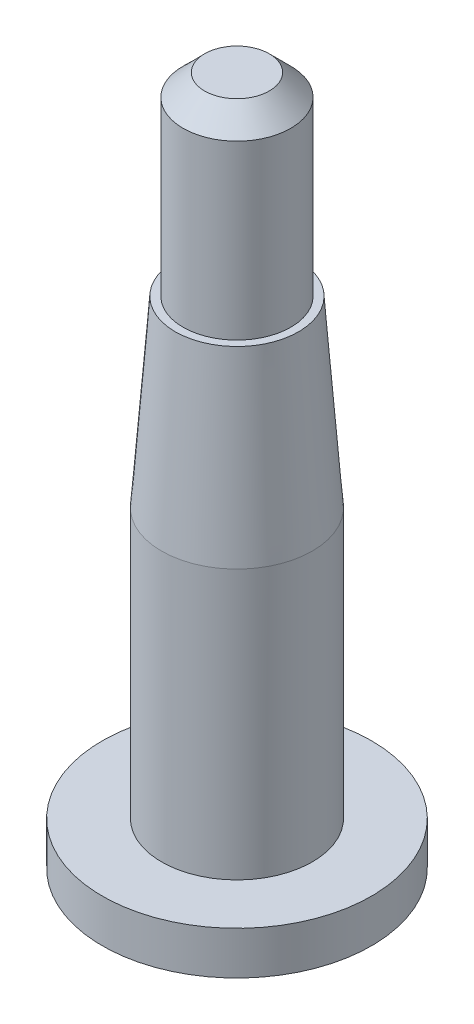
ISO-10303-21;
HEADER;
FILE_DESCRIPTION(('STEP AP214'),'2;1');
FILE_NAME('part.step','',(''),(''),'','','');
FILE_SCHEMA(('AUTOMOTIVE_DESIGN { 1 0 10303 214 1 1 1 1 }'));
ENDSEC;
DATA;
#1=APPLICATION_CONTEXT('core data for automotive mechanical design processes');
#2=APPLICATION_PROTOCOL_DEFINITION('international standard','automotive_design',2000,#1);
#3=PRODUCT_CONTEXT('',#1,'mechanical');
#4=PRODUCT('Part','Part','',(#3));
#5=PRODUCT_RELATED_PRODUCT_CATEGORY('part','',(#4));
#6=PRODUCT_DEFINITION_FORMATION('','',#4);
#7=PRODUCT_DEFINITION_CONTEXT('part definition',#1,'design');
#8=PRODUCT_DEFINITION('design','',#6,#7);
#9=PRODUCT_DEFINITION_SHAPE('','',#8);
#10=(LENGTH_UNIT() NAMED_UNIT(*) SI_UNIT(.MILLI.,.METRE.));
#11=(NAMED_UNIT(*) PLANE_ANGLE_UNIT() SI_UNIT($,.RADIAN.));
#12=(NAMED_UNIT(*) SI_UNIT($,.STERADIAN.) SOLID_ANGLE_UNIT());
#13=UNCERTAINTY_MEASURE_WITH_UNIT(LENGTH_MEASURE(1.E-05),#10,'distance_accuracy_value','');
#14=(GEOMETRIC_REPRESENTATION_CONTEXT(3) GLOBAL_UNCERTAINTY_ASSIGNED_CONTEXT((#13)) GLOBAL_UNIT_ASSIGNED_CONTEXT((#10,
#11,#12)) REPRESENTATION_CONTEXT('',''));
#15=CARTESIAN_POINT('',(0.,0.,0.));
#16=DIRECTION('',(0.,0.,1.));
#17=DIRECTION('',(1.,0.,0.));
#18=AXIS2_PLACEMENT_3D('',#15,#16,#17);
#19=CARTESIAN_POINT('',(0.,25.,0.));
#20=DIRECTION('',(0.,-1.,0.));
#21=DIRECTION('',(0.,0.,-1.));
#22=AXIS2_PLACEMENT_3D('',#19,#20,#21);
#23=CYLINDRICAL_SURFACE('',#22,7.);
#24=CARTESIAN_POINT('',(0.,25.,0.));
#25=DIRECTION('',(0.,1.,0.));
#26=DIRECTION('',(0.,0.,1.));
#27=AXIS2_PLACEMENT_3D('',#24,#25,#26);
#28=CIRCLE('',#27,7.);
#29=CARTESIAN_POINT('',(0.,25.,7.));
#30=VERTEX_POINT('',#29);
#31=EDGE_CURVE('E47',#30,#30,#28,.T.);
#32=ORIENTED_EDGE('',*,*,#31,.F.);
#33=EDGE_LOOP('',(#32));
#34=FACE_BOUND('',#33,.T.);
#35=CARTESIAN_POINT('',(0.,0.,0.));
#36=DIRECTION('',(0.,-1.,0.));
#37=DIRECTION('',(0.,0.,-1.));
#38=AXIS2_PLACEMENT_3D('',#35,#36,#37);
#39=CIRCLE('',#38,7.);
#40=CARTESIAN_POINT('',(0.,0.,-7.));
#41=VERTEX_POINT('',#40);
#42=EDGE_CURVE('E59',#41,#41,#39,.T.);
#43=ORIENTED_EDGE('',*,*,#42,.F.);
#44=EDGE_LOOP('',(#43));
#45=FACE_BOUND('',#44,.T.);
#46=ADVANCED_FACE('F36',(#34,#45),#23,.T.);
#47=CARTESIAN_POINT('',(0.,25.,0.));
#48=DIRECTION('',(0.,-1.,0.));
#49=DIRECTION('',(0.,0.,1.));
#50=AXIS2_PLACEMENT_3D('',#47,#48,#49);
#51=CONICAL_SURFACE('',#50,7.,0.074857171618037);
#52=CARTESIAN_POINT('',(0.,42.,0.));
#53=DIRECTION('',(0.,1.,0.));
#54=DIRECTION('',(0.,0.,1.));
#55=AXIS2_PLACEMENT_3D('',#52,#53,#54);
#56=CIRCLE('',#55,5.72504574946859);
#57=CARTESIAN_POINT('',(0.,42.,5.72504574946859));
#58=VERTEX_POINT('',#57);
#59=EDGE_CURVE('E51',#58,#58,#56,.T.);
#60=ORIENTED_EDGE('',*,*,#59,.F.);
#61=EDGE_LOOP('',(#60));
#62=FACE_BOUND('',#61,.T.);
#63=ORIENTED_EDGE('',*,*,#31,.T.);
#64=EDGE_LOOP('',(#63));
#65=FACE_BOUND('',#64,.T.);
#66=ADVANCED_FACE('F86',(#62,#65),#51,.T.);
#67=CARTESIAN_POINT('',(0.,42.,0.));
#68=DIRECTION('',(0.,1.,0.));
#69=DIRECTION('',(0.,0.,1.));
#70=AXIS2_PLACEMENT_3D('',#67,#68,#69);
#71=PLANE('',#70);
#72=CARTESIAN_POINT('',(0.,42.,0.));
#73=DIRECTION('',(0.,1.,0.));
#74=DIRECTION('',(0.,0.,1.));
#75=AXIS2_PLACEMENT_3D('',#72,#73,#74);
#76=CIRCLE('',#75,5.);
#77=CARTESIAN_POINT('',(0.,42.,5.));
#78=VERTEX_POINT('',#77);
#79=EDGE_CURVE('E56',#78,#78,#76,.T.);
#80=ORIENTED_EDGE('',*,*,#79,.F.);
#81=EDGE_LOOP('',(#80));
#82=FACE_BOUND('',#81,.T.);
#83=ORIENTED_EDGE('',*,*,#59,.T.);
#84=EDGE_LOOP('',(#83));
#85=FACE_BOUND('',#84,.T.);
#86=ADVANCED_FACE('F91',(#82,#85),#71,.T.);
#87=CARTESIAN_POINT('',(0.,60.,0.));
#88=DIRECTION('',(0.,-1.,0.));
#89=DIRECTION('',(0.,0.,-1.));
#90=AXIS2_PLACEMENT_3D('',#87,#88,#89);
#91=CYLINDRICAL_SURFACE('',#90,5.);
#92=CARTESIAN_POINT('',(0.,58.,0.));
#93=DIRECTION('',(0.,1.,0.));
#94=DIRECTION('',(0.,0.,1.));
#95=AXIS2_PLACEMENT_3D('',#92,#93,#94);
#96=CIRCLE('',#95,5.);
#97=CARTESIAN_POINT('',(0.,58.,5.));
#98=VERTEX_POINT('',#97);
#99=EDGE_CURVE('E10',#98,#98,#96,.F.);
#100=ORIENTED_EDGE('',*,*,#99,.T.);
#101=EDGE_LOOP('',(#100));
#102=FACE_BOUND('',#101,.T.);
#103=ORIENTED_EDGE('',*,*,#79,.T.);
#104=EDGE_LOOP('',(#103));
#105=FACE_BOUND('',#104,.T.);
#106=ADVANCED_FACE('F99',(#102,#105),#91,.T.);
#107=CARTESIAN_POINT('',(0.,60.,0.));
#108=DIRECTION('',(0.,1.,0.));
#109=DIRECTION('',(0.,0.,1.));
#110=AXIS2_PLACEMENT_3D('',#107,#108,#109);
#111=PLANE('',#110);
#112=CARTESIAN_POINT('',(0.,60.,0.));
#113=DIRECTION('',(0.,1.,0.));
#114=DIRECTION('',(0.,0.,1.));
#115=AXIS2_PLACEMENT_3D('',#112,#113,#114);
#116=CIRCLE('',#115,3.);
#117=CARTESIAN_POINT('',(0.,60.,3.));
#118=VERTEX_POINT('',#117);
#119=EDGE_CURVE('E43',#118,#118,#116,.T.);
#120=ORIENTED_EDGE('',*,*,#119,.T.);
#121=EDGE_LOOP('',(#120));
#122=FACE_BOUND('',#121,.T.);
#123=ADVANCED_FACE('F103',(#122),#111,.T.);
#124=CARTESIAN_POINT('',(0.,60.,0.));
#125=DIRECTION('',(0.,-1.,0.));
#126=DIRECTION('',(0.,0.,-1.));
#127=AXIS2_PLACEMENT_3D('',#124,#125,#126);
#128=CONICAL_SURFACE('',#127,3.,0.785398163397447);
#129=ORIENTED_EDGE('',*,*,#99,.F.);
#130=EDGE_LOOP('',(#129));
#131=FACE_BOUND('',#130,.T.);
#132=ORIENTED_EDGE('',*,*,#119,.F.);
#133=EDGE_LOOP('',(#132));
#134=FACE_BOUND('',#133,.T.);
#135=ADVANCED_FACE('F38',(#131,#134),#128,.T.);
#136=CARTESIAN_POINT('',(0.,-4.,0.));
#137=DIRECTION('',(0.,1.,0.));
#138=DIRECTION('',(0.,0.,1.));
#139=AXIS2_PLACEMENT_3D('',#136,#137,#138);
#140=CYLINDRICAL_SURFACE('',#139,12.5);
#141=CARTESIAN_POINT('',(0.,-4.,0.));
#142=DIRECTION('',(0.,-1.,0.));
#143=DIRECTION('',(0.,0.,-1.));
#144=AXIS2_PLACEMENT_3D('',#141,#142,#143);
#145=CIRCLE('',#144,12.5);
#146=CARTESIAN_POINT('',(0.,-4.,-12.5));
#147=VERTEX_POINT('',#146);
#148=EDGE_CURVE('E62',#147,#147,#145,.T.);
#149=ORIENTED_EDGE('',*,*,#148,.F.);
#150=EDGE_LOOP('',(#149));
#151=FACE_BOUND('',#150,.T.);
#152=CARTESIAN_POINT('',(0.,0.,0.));
#153=DIRECTION('',(0.,-1.,0.));
#154=DIRECTION('',(0.,0.,-1.));
#155=AXIS2_PLACEMENT_3D('',#152,#153,#154);
#156=CIRCLE('',#155,12.5);
#157=CARTESIAN_POINT('',(0.,0.,-12.5));
#158=VERTEX_POINT('',#157);
#159=EDGE_CURVE('E63',#158,#158,#156,.T.);
#160=ORIENTED_EDGE('',*,*,#159,.T.);
#161=EDGE_LOOP('',(#160));
#162=FACE_BOUND('',#161,.T.);
#163=ADVANCED_FACE('F71',(#151,#162),#140,.T.);
#164=CARTESIAN_POINT('',(0.,-4.,0.));
#165=DIRECTION('',(0.,-1.,0.));
#166=DIRECTION('',(0.,0.,-1.));
#167=AXIS2_PLACEMENT_3D('',#164,#165,#166);
#168=PLANE('',#167);
#169=ORIENTED_EDGE('',*,*,#148,.T.);
#170=EDGE_LOOP('',(#169));
#171=FACE_BOUND('',#170,.T.);
#172=ADVANCED_FACE('F69',(#171),#168,.T.);
#173=CARTESIAN_POINT('',(0.,0.,0.));
#174=DIRECTION('',(0.,-1.,0.));
#175=DIRECTION('',(0.,0.,-1.));
#176=AXIS2_PLACEMENT_3D('',#173,#174,#175);
#177=PLANE('',#176);
#178=ORIENTED_EDGE('',*,*,#42,.T.);
#179=EDGE_LOOP('',(#178));
#180=FACE_BOUND('',#179,.T.);
#181=ORIENTED_EDGE('',*,*,#159,.F.);
#182=EDGE_LOOP('',(#181));
#183=FACE_BOUND('',#182,.T.);
#184=ADVANCED_FACE('F77',(#180,#183),#177,.F.);
#185=CLOSED_SHELL('',(#46,#66,#86,#106,#123,#135,#163,#172,#184));
#186=MANIFOLD_SOLID_BREP('B2',#185);
#187=ADVANCED_BREP_SHAPE_REPRESENTATION('',(#18,#186),#14);
#188=SHAPE_DEFINITION_REPRESENTATION(#9,#187);
ENDSEC;
END-ISO-10303-21;
